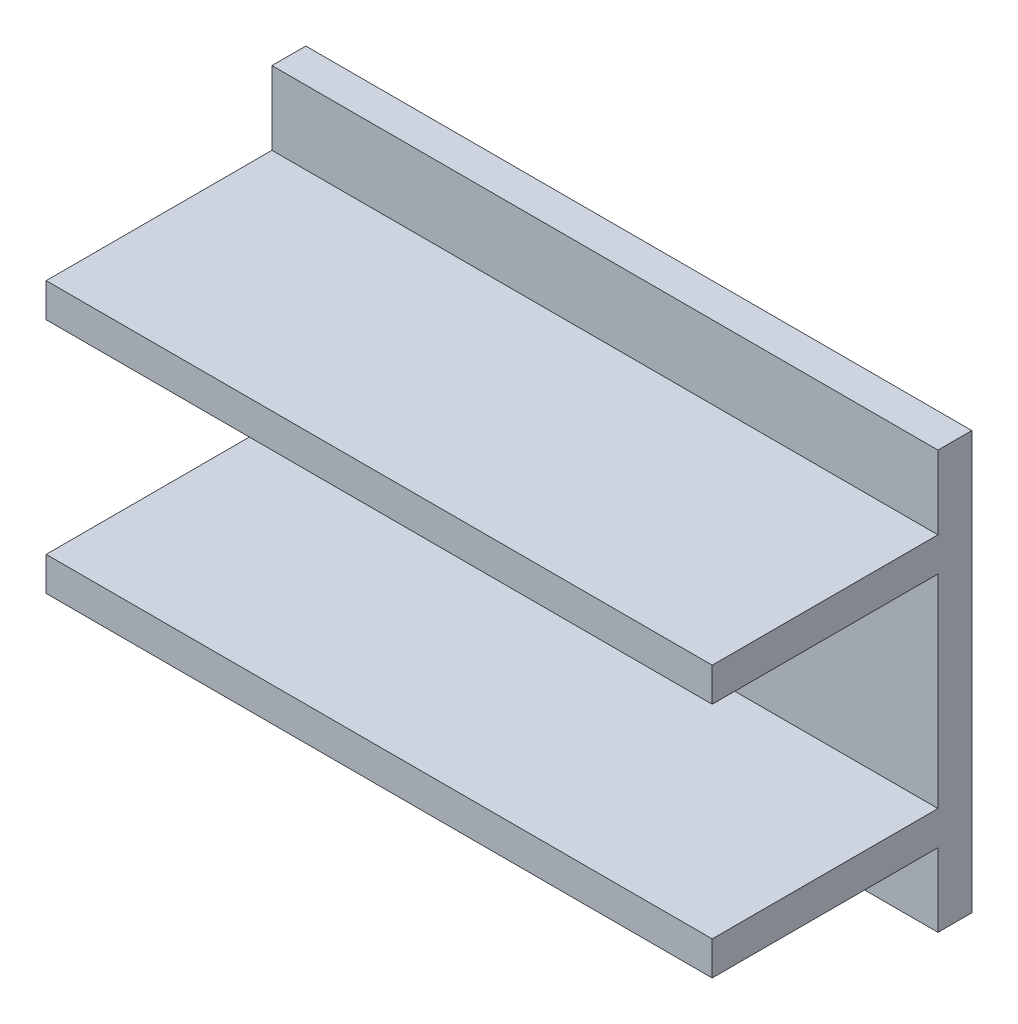
ISO-10303-21;
HEADER;
FILE_DESCRIPTION(('STEP AP214'),'2;1');
FILE_NAME('part.step','',(''),(''),'','','');
FILE_SCHEMA(('AUTOMOTIVE_DESIGN { 1 0 10303 214 1 1 1 1 }'));
ENDSEC;
DATA;
#1=APPLICATION_CONTEXT('core data for automotive mechanical design processes');
#2=APPLICATION_PROTOCOL_DEFINITION('international standard','automotive_design',2000,#1);
#3=PRODUCT_CONTEXT('',#1,'mechanical');
#4=PRODUCT('Part','Part','',(#3));
#5=PRODUCT_RELATED_PRODUCT_CATEGORY('part','',(#4));
#6=PRODUCT_DEFINITION_FORMATION('','',#4);
#7=PRODUCT_DEFINITION_CONTEXT('part definition',#1,'design');
#8=PRODUCT_DEFINITION('design','',#6,#7);
#9=PRODUCT_DEFINITION_SHAPE('','',#8);
#10=(LENGTH_UNIT() NAMED_UNIT(*) SI_UNIT(.MILLI.,.METRE.));
#11=(NAMED_UNIT(*) PLANE_ANGLE_UNIT() SI_UNIT($,.RADIAN.));
#12=(NAMED_UNIT(*) SI_UNIT($,.STERADIAN.) SOLID_ANGLE_UNIT());
#13=UNCERTAINTY_MEASURE_WITH_UNIT(LENGTH_MEASURE(1.E-05),#10,'distance_accuracy_value','');
#14=(GEOMETRIC_REPRESENTATION_CONTEXT(3) GLOBAL_UNCERTAINTY_ASSIGNED_CONTEXT((#13)) GLOBAL_UNIT_ASSIGNED_CONTEXT((#10,
#11,#12)) REPRESENTATION_CONTEXT('',''));
#15=CARTESIAN_POINT('',(0.,0.,0.));
#16=DIRECTION('',(0.,0.,1.));
#17=DIRECTION('',(1.,0.,0.));
#18=AXIS2_PLACEMENT_3D('',#15,#16,#17);
#19=CARTESIAN_POINT('',(0.,0.,3.));
#20=DIRECTION('',(0.,0.,-1.));
#21=DIRECTION('',(-1.,0.,0.));
#22=AXIS2_PLACEMENT_3D('',#19,#20,#21);
#23=PLANE('',#22);
#24=DIRECTION('',(-1.,0.,0.));
#25=VECTOR('',#24,1.);
#26=CARTESIAN_POINT('',(-29.5,-8.99999999999996,3.));
#27=LINE('',#26,#25);
#28=CARTESIAN_POINT('',(29.5,-8.99999999999996,3.));
#29=VERTEX_POINT('',#28);
#30=CARTESIAN_POINT('',(-29.5,-8.99999999999996,3.));
#31=VERTEX_POINT('',#30);
#32=EDGE_CURVE('E149',#29,#31,#27,.T.);
#33=ORIENTED_EDGE('',*,*,#32,.F.);
#34=DIRECTION('',(0.,1.,0.));
#35=VECTOR('',#34,1.);
#36=CARTESIAN_POINT('',(29.5,-18.5,3.));
#37=LINE('',#36,#35);
#38=CARTESIAN_POINT('',(29.5,9.00000000000001,3.));
#39=VERTEX_POINT('',#38);
#40=EDGE_CURVE('E193',#29,#39,#37,.T.);
#41=ORIENTED_EDGE('',*,*,#40,.T.);
#42=DIRECTION('',(1.,0.,0.));
#43=VECTOR('',#42,1.);
#44=CARTESIAN_POINT('',(29.5,9.00000000000001,3.));
#45=LINE('',#44,#43);
#46=CARTESIAN_POINT('',(-29.5,9.00000000000001,3.));
#47=VERTEX_POINT('',#46);
#48=EDGE_CURVE('E176',#47,#39,#45,.T.);
#49=ORIENTED_EDGE('',*,*,#48,.F.);
#50=DIRECTION('',(0.,-1.,0.));
#51=VECTOR('',#50,1.);
#52=CARTESIAN_POINT('',(-29.5,-18.5,3.));
#53=LINE('',#52,#51);
#54=EDGE_CURVE('E64',#47,#31,#53,.T.);
#55=ORIENTED_EDGE('',*,*,#54,.T.);
#56=EDGE_LOOP('',(#33,#41,#49,#55));
#57=FACE_BOUND('',#56,.T.);
#58=ADVANCED_FACE('F41',(#57),#23,.F.);
#59=DIRECTION('',(1.,0.,0.));
#60=VECTOR('',#59,1.);
#61=CARTESIAN_POINT('',(-29.5,-12.,3.));
#62=LINE('',#61,#60);
#63=CARTESIAN_POINT('',(-29.5,-12.,3.));
#64=VERTEX_POINT('',#63);
#65=CARTESIAN_POINT('',(29.5,-12.,3.));
#66=VERTEX_POINT('',#65);
#67=EDGE_CURVE('E56',#64,#66,#62,.T.);
#68=ORIENTED_EDGE('',*,*,#67,.F.);
#69=CARTESIAN_POINT('',(-29.5,-18.5,3.));
#70=VERTEX_POINT('',#69);
#71=EDGE_CURVE('E153',#64,#70,#53,.T.);
#72=ORIENTED_EDGE('',*,*,#71,.T.);
#73=DIRECTION('',(1.,0.,0.));
#74=VECTOR('',#73,1.);
#75=CARTESIAN_POINT('',(-29.5,-18.5,3.));
#76=LINE('',#75,#74);
#77=CARTESIAN_POINT('',(29.5,-18.5,3.));
#78=VERTEX_POINT('',#77);
#79=EDGE_CURVE('E198',#70,#78,#76,.T.);
#80=ORIENTED_EDGE('',*,*,#79,.T.);
#81=EDGE_CURVE('E190',#78,#66,#37,.T.);
#82=ORIENTED_EDGE('',*,*,#81,.T.);
#83=EDGE_LOOP('',(#68,#72,#80,#82));
#84=FACE_BOUND('',#83,.T.);
#85=ADVANCED_FACE('F227',(#84),#23,.F.);
#86=DIRECTION('',(-1.,0.,0.));
#87=VECTOR('',#86,1.);
#88=CARTESIAN_POINT('',(29.5,12.,3.));
#89=LINE('',#88,#87);
#90=CARTESIAN_POINT('',(29.5,12.,3.));
#91=VERTEX_POINT('',#90);
#92=CARTESIAN_POINT('',(-29.5,12.,3.));
#93=VERTEX_POINT('',#92);
#94=EDGE_CURVE('E179',#91,#93,#89,.T.);
#95=ORIENTED_EDGE('',*,*,#94,.F.);
#96=CARTESIAN_POINT('',(29.5,18.5,3.));
#97=VERTEX_POINT('',#96);
#98=EDGE_CURVE('E194',#91,#97,#37,.T.);
#99=ORIENTED_EDGE('',*,*,#98,.T.);
#100=DIRECTION('',(-1.,0.,0.));
#101=VECTOR('',#100,1.);
#102=CARTESIAN_POINT('',(-29.5,18.5,3.));
#103=LINE('',#102,#101);
#104=CARTESIAN_POINT('',(-29.5,18.5,3.));
#105=VERTEX_POINT('',#104);
#106=EDGE_CURVE('E192',#97,#105,#103,.T.);
#107=ORIENTED_EDGE('',*,*,#106,.T.);
#108=EDGE_CURVE('E196',#105,#93,#53,.T.);
#109=ORIENTED_EDGE('',*,*,#108,.T.);
#110=EDGE_LOOP('',(#95,#99,#107,#109));
#111=FACE_BOUND('',#110,.T.);
#112=ADVANCED_FACE('F243',(#111),#23,.F.);
#113=CARTESIAN_POINT('',(29.5,-18.5,3.));
#114=DIRECTION('',(-1.,0.,0.));
#115=DIRECTION('',(0.,0.,1.));
#116=AXIS2_PLACEMENT_3D('',#113,#114,#115);
#117=PLANE('',#116);
#118=DIRECTION('',(0.,1.,0.));
#119=VECTOR('',#118,1.);
#120=CARTESIAN_POINT('',(29.5,-18.5,0.));
#121=LINE('',#120,#119);
#122=CARTESIAN_POINT('',(29.5,-18.5,0.));
#123=VERTEX_POINT('',#122);
#124=CARTESIAN_POINT('',(29.5,18.5,0.));
#125=VERTEX_POINT('',#124);
#126=EDGE_CURVE('E154',#123,#125,#121,.T.);
#127=ORIENTED_EDGE('',*,*,#126,.T.);
#128=DIRECTION('',(0.,0.,-1.));
#129=VECTOR('',#128,1.);
#130=CARTESIAN_POINT('',(29.5,18.5,3.));
#131=LINE('',#130,#129);
#132=EDGE_CURVE('E11',#97,#125,#131,.T.);
#133=ORIENTED_EDGE('',*,*,#132,.F.);
#134=ORIENTED_EDGE('',*,*,#98,.F.);
#135=DIRECTION('',(0.,0.,-1.));
#136=VECTOR('',#135,1.);
#137=CARTESIAN_POINT('',(29.5,12.,23.));
#138=LINE('',#137,#136);
#139=CARTESIAN_POINT('',(29.5,12.,23.));
#140=VERTEX_POINT('',#139);
#141=EDGE_CURVE('E163',#140,#91,#138,.T.);
#142=ORIENTED_EDGE('',*,*,#141,.F.);
#143=DIRECTION('',(0.,1.,0.));
#144=VECTOR('',#143,1.);
#145=CARTESIAN_POINT('',(29.5,12.,23.));
#146=LINE('',#145,#144);
#147=CARTESIAN_POINT('',(29.5,9.00000000000001,23.));
#148=VERTEX_POINT('',#147);
#149=EDGE_CURVE('E180',#148,#140,#146,.T.);
#150=ORIENTED_EDGE('',*,*,#149,.F.);
#151=DIRECTION('',(0.,0.,-1.));
#152=VECTOR('',#151,1.);
#153=CARTESIAN_POINT('',(29.5,9.00000000000001,23.));
#154=LINE('',#153,#152);
#155=EDGE_CURVE('E172',#148,#39,#154,.T.);
#156=ORIENTED_EDGE('',*,*,#155,.T.);
#157=ORIENTED_EDGE('',*,*,#40,.F.);
#158=DIRECTION('',(0.,0.,-1.));
#159=VECTOR('',#158,1.);
#160=CARTESIAN_POINT('',(29.5,-8.99999999999996,23.));
#161=LINE('',#160,#159);
#162=CARTESIAN_POINT('',(29.5,-8.99999999999996,23.));
#163=VERTEX_POINT('',#162);
#164=EDGE_CURVE('E159',#163,#29,#161,.T.);
#165=ORIENTED_EDGE('',*,*,#164,.F.);
#166=DIRECTION('',(0.,1.,0.));
#167=VECTOR('',#166,1.);
#168=CARTESIAN_POINT('',(29.5,-12.,23.));
#169=LINE('',#168,#167);
#170=CARTESIAN_POINT('',(29.5,-12.,23.));
#171=VERTEX_POINT('',#170);
#172=EDGE_CURVE('E139',#171,#163,#169,.T.);
#173=ORIENTED_EDGE('',*,*,#172,.F.);
#174=DIRECTION('',(0.,0.,-1.));
#175=VECTOR('',#174,1.);
#176=CARTESIAN_POINT('',(29.5,-12.,23.));
#177=LINE('',#176,#175);
#178=EDGE_CURVE('E136',#171,#66,#177,.T.);
#179=ORIENTED_EDGE('',*,*,#178,.T.);
#180=ORIENTED_EDGE('',*,*,#81,.F.);
#181=DIRECTION('',(0.,0.,-1.));
#182=VECTOR('',#181,1.);
#183=CARTESIAN_POINT('',(29.5,-18.5,3.));
#184=LINE('',#183,#182);
#185=EDGE_CURVE('E199',#78,#123,#184,.T.);
#186=ORIENTED_EDGE('',*,*,#185,.T.);
#187=EDGE_LOOP('',(#127,#133,#134,#142,#150,#156,#157,#165,#173,#179,#180,#186));
#188=FACE_BOUND('',#187,.T.);
#189=ADVANCED_FACE('F43',(#188),#117,.F.);
#190=CARTESIAN_POINT('',(-29.5,18.5,3.));
#191=DIRECTION('',(0.,-1.,0.));
#192=DIRECTION('',(0.,0.,-1.));
#193=AXIS2_PLACEMENT_3D('',#190,#191,#192);
#194=PLANE('',#193);
#195=DIRECTION('',(-1.,0.,0.));
#196=VECTOR('',#195,1.);
#197=CARTESIAN_POINT('',(-29.5,18.5,0.));
#198=LINE('',#197,#196);
#199=CARTESIAN_POINT('',(-29.5,18.5,0.));
#200=VERTEX_POINT('',#199);
#201=EDGE_CURVE('E157',#125,#200,#198,.T.);
#202=ORIENTED_EDGE('',*,*,#201,.T.);
#203=DIRECTION('',(0.,0.,-1.));
#204=VECTOR('',#203,1.);
#205=CARTESIAN_POINT('',(-29.5,18.5,3.));
#206=LINE('',#205,#204);
#207=EDGE_CURVE('E49',#105,#200,#206,.T.);
#208=ORIENTED_EDGE('',*,*,#207,.F.);
#209=ORIENTED_EDGE('',*,*,#106,.F.);
#210=ORIENTED_EDGE('',*,*,#132,.T.);
#211=EDGE_LOOP('',(#202,#208,#209,#210));
#212=FACE_BOUND('',#211,.T.);
#213=ADVANCED_FACE('F245',(#212),#194,.F.);
#214=CARTESIAN_POINT('',(-29.5,-18.5,3.));
#215=DIRECTION('',(1.,0.,0.));
#216=DIRECTION('',(0.,0.,-1.));
#217=AXIS2_PLACEMENT_3D('',#214,#215,#216);
#218=PLANE('',#217);
#219=DIRECTION('',(0.,-1.,0.));
#220=VECTOR('',#219,1.);
#221=CARTESIAN_POINT('',(-29.5,-18.5,0.));
#222=LINE('',#221,#220);
#223=CARTESIAN_POINT('',(-29.5,-18.5,0.));
#224=VERTEX_POINT('',#223);
#225=EDGE_CURVE('E202',#200,#224,#222,.T.);
#226=ORIENTED_EDGE('',*,*,#225,.T.);
#227=DIRECTION('',(0.,0.,-1.));
#228=VECTOR('',#227,1.);
#229=CARTESIAN_POINT('',(-29.5,-18.5,3.));
#230=LINE('',#229,#228);
#231=EDGE_CURVE('E208',#70,#224,#230,.T.);
#232=ORIENTED_EDGE('',*,*,#231,.F.);
#233=ORIENTED_EDGE('',*,*,#71,.F.);
#234=DIRECTION('',(0.,0.,-1.));
#235=VECTOR('',#234,1.);
#236=CARTESIAN_POINT('',(-29.5,-12.,23.));
#237=LINE('',#236,#235);
#238=CARTESIAN_POINT('',(-29.5,-12.,23.));
#239=VERTEX_POINT('',#238);
#240=EDGE_CURVE('E134',#239,#64,#237,.T.);
#241=ORIENTED_EDGE('',*,*,#240,.F.);
#242=DIRECTION('',(0.,-1.,0.));
#243=VECTOR('',#242,1.);
#244=CARTESIAN_POINT('',(-29.5,-12.,23.));
#245=LINE('',#244,#243);
#246=CARTESIAN_POINT('',(-29.5,-8.99999999999996,23.));
#247=VERTEX_POINT('',#246);
#248=EDGE_CURVE('E140',#247,#239,#245,.T.);
#249=ORIENTED_EDGE('',*,*,#248,.F.);
#250=DIRECTION('',(0.,0.,-1.));
#251=VECTOR('',#250,1.);
#252=CARTESIAN_POINT('',(-29.5,-8.99999999999996,23.));
#253=LINE('',#252,#251);
#254=EDGE_CURVE('E233',#247,#31,#253,.T.);
#255=ORIENTED_EDGE('',*,*,#254,.T.);
#256=ORIENTED_EDGE('',*,*,#54,.F.);
#257=DIRECTION('',(0.,0.,-1.));
#258=VECTOR('',#257,1.);
#259=CARTESIAN_POINT('',(-29.5,9.00000000000001,23.));
#260=LINE('',#259,#258);
#261=CARTESIAN_POINT('',(-29.5,9.00000000000001,23.));
#262=VERTEX_POINT('',#261);
#263=EDGE_CURVE('E169',#262,#47,#260,.T.);
#264=ORIENTED_EDGE('',*,*,#263,.F.);
#265=DIRECTION('',(0.,-1.,0.));
#266=VECTOR('',#265,1.);
#267=CARTESIAN_POINT('',(-29.5,12.,23.));
#268=LINE('',#267,#266);
#269=CARTESIAN_POINT('',(-29.5,12.,23.));
#270=VERTEX_POINT('',#269);
#271=EDGE_CURVE('E184',#270,#262,#268,.T.);
#272=ORIENTED_EDGE('',*,*,#271,.F.);
#273=DIRECTION('',(0.,0.,-1.));
#274=VECTOR('',#273,1.);
#275=CARTESIAN_POINT('',(-29.5,12.,23.));
#276=LINE('',#275,#274);
#277=EDGE_CURVE('E166',#270,#93,#276,.T.);
#278=ORIENTED_EDGE('',*,*,#277,.T.);
#279=ORIENTED_EDGE('',*,*,#108,.F.);
#280=ORIENTED_EDGE('',*,*,#207,.T.);
#281=EDGE_LOOP('',(#226,#232,#233,#241,#249,#255,#256,#264,#272,#278,#279,#280));
#282=FACE_BOUND('',#281,.T.);
#283=ADVANCED_FACE('F151',(#282),#218,.F.);
#284=CARTESIAN_POINT('',(-29.5,-18.5,3.));
#285=DIRECTION('',(0.,1.,0.));
#286=DIRECTION('',(0.,0.,1.));
#287=AXIS2_PLACEMENT_3D('',#284,#285,#286);
#288=PLANE('',#287);
#289=DIRECTION('',(1.,0.,0.));
#290=VECTOR('',#289,1.);
#291=CARTESIAN_POINT('',(-29.5,-18.5,0.));
#292=LINE('',#291,#290);
#293=EDGE_CURVE('E204',#224,#123,#292,.T.);
#294=ORIENTED_EDGE('',*,*,#293,.T.);
#295=ORIENTED_EDGE('',*,*,#185,.F.);
#296=ORIENTED_EDGE('',*,*,#79,.F.);
#297=ORIENTED_EDGE('',*,*,#231,.T.);
#298=EDGE_LOOP('',(#294,#295,#296,#297));
#299=FACE_BOUND('',#298,.T.);
#300=ADVANCED_FACE('F222',(#299),#288,.F.);
#301=CARTESIAN_POINT('',(0.,0.,0.));
#302=DIRECTION('',(0.,0.,-1.));
#303=DIRECTION('',(-1.,0.,0.));
#304=AXIS2_PLACEMENT_3D('',#301,#302,#303);
#305=PLANE('',#304);
#306=ORIENTED_EDGE('',*,*,#126,.F.);
#307=ORIENTED_EDGE('',*,*,#293,.F.);
#308=ORIENTED_EDGE('',*,*,#225,.F.);
#309=ORIENTED_EDGE('',*,*,#201,.F.);
#310=EDGE_LOOP('',(#306,#307,#308,#309));
#311=FACE_BOUND('',#310,.T.);
#312=ADVANCED_FACE('F219',(#311),#305,.T.);
#313=CARTESIAN_POINT('',(29.5,12.,23.));
#314=DIRECTION('',(0.,-1.,0.));
#315=DIRECTION('',(0.,0.,-1.));
#316=AXIS2_PLACEMENT_3D('',#313,#314,#315);
#317=PLANE('',#316);
#318=ORIENTED_EDGE('',*,*,#94,.T.);
#319=ORIENTED_EDGE('',*,*,#277,.F.);
#320=DIRECTION('',(-1.,0.,0.));
#321=VECTOR('',#320,1.);
#322=CARTESIAN_POINT('',(29.5,12.,23.));
#323=LINE('',#322,#321);
#324=EDGE_CURVE('E186',#140,#270,#323,.T.);
#325=ORIENTED_EDGE('',*,*,#324,.F.);
#326=ORIENTED_EDGE('',*,*,#141,.T.);
#327=EDGE_LOOP('',(#318,#319,#325,#326));
#328=FACE_BOUND('',#327,.T.);
#329=ADVANCED_FACE('F282',(#328),#317,.F.);
#330=CARTESIAN_POINT('',(29.5,9.00000000000001,23.));
#331=DIRECTION('',(0.,1.,0.));
#332=DIRECTION('',(-1.,0.,0.));
#333=AXIS2_PLACEMENT_3D('',#330,#331,#332);
#334=PLANE('',#333);
#335=ORIENTED_EDGE('',*,*,#48,.T.);
#336=ORIENTED_EDGE('',*,*,#155,.F.);
#337=DIRECTION('',(1.,0.,0.));
#338=VECTOR('',#337,1.);
#339=CARTESIAN_POINT('',(29.5,9.00000000000001,23.));
#340=LINE('',#339,#338);
#341=EDGE_CURVE('E175',#262,#148,#340,.T.);
#342=ORIENTED_EDGE('',*,*,#341,.F.);
#343=ORIENTED_EDGE('',*,*,#263,.T.);
#344=EDGE_LOOP('',(#335,#336,#342,#343));
#345=FACE_BOUND('',#344,.T.);
#346=ADVANCED_FACE('F285',(#345),#334,.F.);
#347=CARTESIAN_POINT('',(0.,0.,23.));
#348=DIRECTION('',(0.,0.,-1.));
#349=DIRECTION('',(-1.,0.,0.));
#350=AXIS2_PLACEMENT_3D('',#347,#348,#349);
#351=PLANE('',#350);
#352=ORIENTED_EDGE('',*,*,#149,.T.);
#353=ORIENTED_EDGE('',*,*,#324,.T.);
#354=ORIENTED_EDGE('',*,*,#271,.T.);
#355=ORIENTED_EDGE('',*,*,#341,.T.);
#356=EDGE_LOOP('',(#352,#353,#354,#355));
#357=FACE_BOUND('',#356,.T.);
#358=ADVANCED_FACE('F294',(#357),#351,.F.);
#359=CARTESIAN_POINT('',(-29.5,-12.,23.));
#360=DIRECTION('',(0.,1.,0.));
#361=DIRECTION('',(0.,0.,1.));
#362=AXIS2_PLACEMENT_3D('',#359,#360,#361);
#363=PLANE('',#362);
#364=ORIENTED_EDGE('',*,*,#67,.T.);
#365=ORIENTED_EDGE('',*,*,#178,.F.);
#366=DIRECTION('',(1.,0.,0.));
#367=VECTOR('',#366,1.);
#368=CARTESIAN_POINT('',(-29.5,-12.,23.));
#369=LINE('',#368,#367);
#370=EDGE_CURVE('E130',#239,#171,#369,.T.);
#371=ORIENTED_EDGE('',*,*,#370,.F.);
#372=ORIENTED_EDGE('',*,*,#240,.T.);
#373=EDGE_LOOP('',(#364,#365,#371,#372));
#374=FACE_BOUND('',#373,.T.);
#375=ADVANCED_FACE('F132',(#374),#363,.F.);
#376=CARTESIAN_POINT('',(-29.5,-8.99999999999996,23.));
#377=DIRECTION('',(0.,-1.,0.));
#378=DIRECTION('',(0.,0.,-1.));
#379=AXIS2_PLACEMENT_3D('',#376,#377,#378);
#380=PLANE('',#379);
#381=ORIENTED_EDGE('',*,*,#32,.T.);
#382=ORIENTED_EDGE('',*,*,#254,.F.);
#383=DIRECTION('',(-1.,0.,0.));
#384=VECTOR('',#383,1.);
#385=CARTESIAN_POINT('',(-29.5,-8.99999999999996,23.));
#386=LINE('',#385,#384);
#387=EDGE_CURVE('E145',#163,#247,#386,.T.);
#388=ORIENTED_EDGE('',*,*,#387,.F.);
#389=ORIENTED_EDGE('',*,*,#164,.T.);
#390=EDGE_LOOP('',(#381,#382,#388,#389));
#391=FACE_BOUND('',#390,.T.);
#392=ADVANCED_FACE('F237',(#391),#380,.F.);
#393=CARTESIAN_POINT('',(0.,0.,23.));
#394=DIRECTION('',(0.,0.,-1.));
#395=DIRECTION('',(-1.,0.,0.));
#396=AXIS2_PLACEMENT_3D('',#393,#394,#395);
#397=PLANE('',#396);
#398=ORIENTED_EDGE('',*,*,#248,.T.);
#399=ORIENTED_EDGE('',*,*,#370,.T.);
#400=ORIENTED_EDGE('',*,*,#172,.T.);
#401=ORIENTED_EDGE('',*,*,#387,.T.);
#402=EDGE_LOOP('',(#398,#399,#400,#401));
#403=FACE_BOUND('',#402,.T.);
#404=ADVANCED_FACE('F143',(#403),#397,.F.);
#405=CLOSED_SHELL('',(#58,#85,#112,#189,#213,#283,#300,#312,#329,#346,#358,#375,#392,#404));
#406=MANIFOLD_SOLID_BREP('B2',#405);
#407=ADVANCED_BREP_SHAPE_REPRESENTATION('',(#18,#406),#14);
#408=SHAPE_DEFINITION_REPRESENTATION(#9,#407);
ENDSEC;
END-ISO-10303-21;
